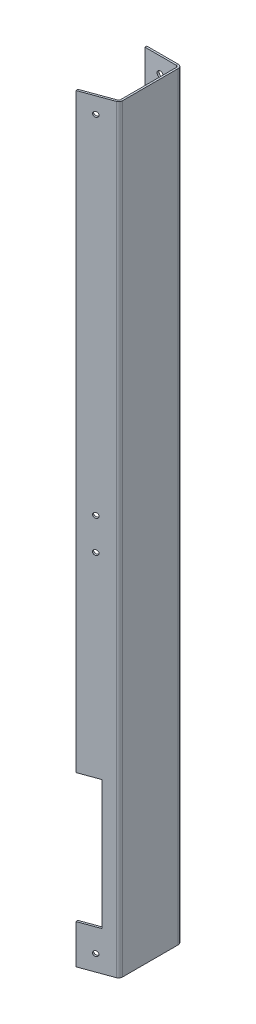
ISO-10303-21;
HEADER;
FILE_DESCRIPTION(('STEP AP214'),'2;1');
FILE_NAME('part.step','',(''),(''),'','','');
FILE_SCHEMA(('AUTOMOTIVE_DESIGN { 1 0 10303 214 1 1 1 1 }'));
ENDSEC;
DATA;
#1=APPLICATION_CONTEXT('core data for automotive mechanical design processes');
#2=APPLICATION_PROTOCOL_DEFINITION('international standard','automotive_design',2000,#1);
#3=PRODUCT_CONTEXT('',#1,'mechanical');
#4=PRODUCT('Part','Part','',(#3));
#5=PRODUCT_RELATED_PRODUCT_CATEGORY('part','',(#4));
#6=PRODUCT_DEFINITION_FORMATION('','',#4);
#7=PRODUCT_DEFINITION_CONTEXT('part definition',#1,'design');
#8=PRODUCT_DEFINITION('design','',#6,#7);
#9=PRODUCT_DEFINITION_SHAPE('','',#8);
#10=(LENGTH_UNIT() NAMED_UNIT(*) SI_UNIT(.MILLI.,.METRE.));
#11=(NAMED_UNIT(*) PLANE_ANGLE_UNIT() SI_UNIT($,.RADIAN.));
#12=(NAMED_UNIT(*) SI_UNIT($,.STERADIAN.) SOLID_ANGLE_UNIT());
#13=UNCERTAINTY_MEASURE_WITH_UNIT(LENGTH_MEASURE(1.E-05),#10,'distance_accuracy_value','');
#14=(GEOMETRIC_REPRESENTATION_CONTEXT(3) GLOBAL_UNCERTAINTY_ASSIGNED_CONTEXT((#13)) GLOBAL_UNIT_ASSIGNED_CONTEXT((#10,
#11,#12)) REPRESENTATION_CONTEXT('',''));
#15=CARTESIAN_POINT('',(0.,0.,0.));
#16=DIRECTION('',(0.,0.,1.));
#17=DIRECTION('',(1.,0.,0.));
#18=AXIS2_PLACEMENT_3D('',#15,#16,#17);
#19=CARTESIAN_POINT('',(-25.7459869181647,-300.,32.3745062313051));
#20=DIRECTION('',(-0.93969262078591,0.,0.342020143325666));
#21=DIRECTION('',(0.342020143325666,0.,0.93969262078591));
#22=AXIS2_PLACEMENT_3D('',#19,#20,#21);
#23=PLANE('',#22);
#24=DIRECTION('',(0.,-1.,0.));
#25=VECTOR('',#24,1.);
#26=CARTESIAN_POINT('',(-25.7459869181647,-300.,32.3745062313051));
#27=LINE('',#26,#25);
#28=CARTESIAN_POINT('',(-25.7459869181647,300.,32.3745062313051));
#29=VERTEX_POINT('',#28);
#30=CARTESIAN_POINT('',(-25.7459869181647,-167.,32.3745062313051));
#31=VERTEX_POINT('',#30);
#32=EDGE_CURVE('E311',#29,#31,#27,.T.);
#33=ORIENTED_EDGE('',*,*,#32,.T.);
#34=DIRECTION('',(0.342020143325666,0.,0.939692620785909));
#35=VECTOR('',#34,1.);
#36=CARTESIAN_POINT('',(-44.3056389205256,-167.,-18.6177185581176));
#37=LINE('',#36,#35);
#38=CARTESIAN_POINT('',(-25.2329567031762,-167.,33.7840451624839));
#39=VERTEX_POINT('',#38);
#40=EDGE_CURVE('E287',#31,#39,#37,.T.);
#41=ORIENTED_EDGE('',*,*,#40,.T.);
#42=DIRECTION('',(0.,-1.,0.));
#43=VECTOR('',#42,1.);
#44=CARTESIAN_POINT('',(-25.2329567031762,-300.,33.7840451624839));
#45=LINE('',#44,#43);
#46=CARTESIAN_POINT('',(-25.2329567031762,300.,33.7840451624839));
#47=VERTEX_POINT('',#46);
#48=EDGE_CURVE('E535',#47,#39,#45,.T.);
#49=ORIENTED_EDGE('',*,*,#48,.F.);
#50=DIRECTION('',(0.342020143325666,0.,0.93969262078591));
#51=VECTOR('',#50,1.);
#52=CARTESIAN_POINT('',(-25.7459869181647,300.,32.3745062313051));
#53=LINE('',#52,#51);
#54=EDGE_CURVE('E319',#29,#47,#53,.T.);
#55=ORIENTED_EDGE('',*,*,#54,.F.);
#56=EDGE_LOOP('',(#33,#41,#49,#55));
#57=FACE_BOUND('',#56,.T.);
#58=ADVANCED_FACE('F175',(#57),#23,.T.);
#59=CARTESIAN_POINT('',(22.1342917352885,0.,-24.6000000000001));
#60=DIRECTION('',(0.,0.,1.));
#61=DIRECTION('',(1.,0.,0.));
#62=AXIS2_PLACEMENT_3D('',#59,#60,#61);
#63=PLANE('',#62);
#64=CARTESIAN_POINT('',(-15.7,-87.2999999999995,-24.6));
#65=DIRECTION('',(0.,0.,-1.));
#66=DIRECTION('',(-1.,0.,0.));
#67=AXIS2_PLACEMENT_3D('',#64,#65,#66);
#68=CIRCLE('',#67,2.5);
#69=CARTESIAN_POINT('',(-18.2,-87.2999999999995,-24.6));
#70=VERTEX_POINT('',#69);
#71=EDGE_CURVE('E587',#70,#70,#68,.T.);
#72=ORIENTED_EDGE('',*,*,#71,.F.);
#73=EDGE_LOOP('',(#72));
#74=FACE_BOUND('',#73,.T.);
#75=CARTESIAN_POINT('',(-15.7,287.3,-24.6));
#76=DIRECTION('',(0.,0.,-1.));
#77=DIRECTION('',(-1.,0.,0.));
#78=AXIS2_PLACEMENT_3D('',#75,#76,#77);
#79=CIRCLE('',#78,2.5);
#80=CARTESIAN_POINT('',(-18.2,287.3,-24.6));
#81=VERTEX_POINT('',#80);
#82=EDGE_CURVE('E573',#81,#81,#79,.T.);
#83=ORIENTED_EDGE('',*,*,#82,.F.);
#84=EDGE_LOOP('',(#83));
#85=FACE_BOUND('',#84,.T.);
#86=DIRECTION('',(0.,1.,0.));
#87=VECTOR('',#86,1.);
#88=CARTESIAN_POINT('',(-3.00000000000001,0.,-24.6));
#89=LINE('',#88,#87);
#90=CARTESIAN_POINT('',(-3.00000000000001,-299.999999999999,-24.6));
#91=VERTEX_POINT('',#90);
#92=CARTESIAN_POINT('',(-3.00000000000001,300.,-24.6));
#93=VERTEX_POINT('',#92);
#94=EDGE_CURVE('E416',#91,#93,#89,.T.);
#95=ORIENTED_EDGE('',*,*,#94,.F.);
#96=DIRECTION('',(-1.,0.,0.));
#97=VECTOR('',#96,1.);
#98=CARTESIAN_POINT('',(-27.8657082647115,-300.,-24.5999999999999));
#99=LINE('',#98,#97);
#100=CARTESIAN_POINT('',(-27.8657082647115,-300.,-24.5999999999999));
#101=VERTEX_POINT('',#100);
#102=EDGE_CURVE('E401',#91,#101,#99,.T.);
#103=ORIENTED_EDGE('',*,*,#102,.T.);
#104=DIRECTION('',(0.,1.,0.));
#105=VECTOR('',#104,1.);
#106=CARTESIAN_POINT('',(-27.8657082647115,-300.,-24.5999999999999));
#107=LINE('',#106,#105);
#108=CARTESIAN_POINT('',(-27.8657082647115,300.,-24.5999999999999));
#109=VERTEX_POINT('',#108);
#110=EDGE_CURVE('E399',#101,#109,#107,.T.);
#111=ORIENTED_EDGE('',*,*,#110,.T.);
#112=DIRECTION('',(1.,0.,0.));
#113=VECTOR('',#112,1.);
#114=CARTESIAN_POINT('',(-27.8657082647115,300.,-24.5999999999999));
#115=LINE('',#114,#113);
#116=EDGE_CURVE('E429',#109,#93,#115,.T.);
#117=ORIENTED_EDGE('',*,*,#116,.T.);
#118=EDGE_LOOP('',(#95,#103,#111,#117));
#119=FACE_BOUND('',#118,.T.);
#120=CARTESIAN_POINT('',(-15.7,87.3,-24.6));
#121=DIRECTION('',(0.,0.,-1.));
#122=DIRECTION('',(-1.,0.,0.));
#123=AXIS2_PLACEMENT_3D('',#120,#121,#122);
#124=CIRCLE('',#123,2.5);
#125=CARTESIAN_POINT('',(-18.2,87.3,-24.6));
#126=VERTEX_POINT('',#125);
#127=EDGE_CURVE('E584',#126,#126,#124,.T.);
#128=ORIENTED_EDGE('',*,*,#127,.F.);
#129=EDGE_LOOP('',(#128));
#130=FACE_BOUND('',#129,.T.);
#131=CARTESIAN_POINT('',(-15.7,-287.299999999999,-24.6));
#132=DIRECTION('',(0.,0.,-1.));
#133=DIRECTION('',(-1.,0.,0.));
#134=AXIS2_PLACEMENT_3D('',#131,#132,#133);
#135=CIRCLE('',#134,2.5);
#136=CARTESIAN_POINT('',(-18.2,-287.299999999999,-24.6));
#137=VERTEX_POINT('',#136);
#138=EDGE_CURVE('E596',#137,#137,#135,.T.);
#139=ORIENTED_EDGE('',*,*,#138,.F.);
#140=EDGE_LOOP('',(#139));
#141=FACE_BOUND('',#140,.T.);
#142=ADVANCED_FACE('F656',(#74,#85,#119,#130,#141),#63,.F.);
#143=CARTESIAN_POINT('',(-1.5,300.,-50.));
#144=DIRECTION('',(0.,1.,0.));
#145=DIRECTION('',(0.,0.,1.));
#146=AXIS2_PLACEMENT_3D('',#143,#144,#145);
#147=PLANE('',#146);
#148=DIRECTION('',(0.,0.,1.));
#149=VECTOR('',#148,1.);
#150=CARTESIAN_POINT('',(-1.5,300.,-50.));
#151=LINE('',#150,#149);
#152=CARTESIAN_POINT('',(-1.5,300.,-21.6));
#153=VERTEX_POINT('',#152);
#154=CARTESIAN_POINT('',(-1.5,300.,22.4993773853709));
#155=VERTEX_POINT('',#154);
#156=EDGE_CURVE('E433',#153,#155,#151,.T.);
#157=ORIENTED_EDGE('',*,*,#156,.T.);
#158=DIRECTION('',(1.,0.,0.));
#159=VECTOR('',#158,1.);
#160=CARTESIAN_POINT('',(-1.5,300.,22.4993773853709));
#161=LINE('',#160,#159);
#162=CARTESIAN_POINT('',(0.,300.,22.4993773853709));
#163=VERTEX_POINT('',#162);
#164=EDGE_CURVE('E12',#155,#163,#161,.T.);
#165=ORIENTED_EDGE('',*,*,#164,.T.);
#166=DIRECTION('',(0.,0.,1.));
#167=VECTOR('',#166,1.);
#168=CARTESIAN_POINT('',(0.,300.,-50.));
#169=LINE('',#168,#167);
#170=CARTESIAN_POINT('',(0.,300.,-21.6));
#171=VERTEX_POINT('',#170);
#172=EDGE_CURVE('E378',#171,#163,#169,.T.);
#173=ORIENTED_EDGE('',*,*,#172,.F.);
#174=DIRECTION('',(1.,0.,0.));
#175=VECTOR('',#174,1.);
#176=CARTESIAN_POINT('',(-1.5,300.,-21.6));
#177=LINE('',#176,#175);
#178=EDGE_CURVE('E383',#153,#171,#177,.T.);
#179=ORIENTED_EDGE('',*,*,#178,.F.);
#180=EDGE_LOOP('',(#157,#165,#173,#179));
#181=FACE_BOUND('',#180,.T.);
#182=ADVANCED_FACE('F172',(#181),#147,.T.);
#183=CARTESIAN_POINT('',(-1.5,-300.,-50.));
#184=DIRECTION('',(0.,-1.,0.));
#185=DIRECTION('',(0.,0.,-1.));
#186=AXIS2_PLACEMENT_3D('',#183,#184,#185);
#187=PLANE('',#186);
#188=DIRECTION('',(0.,0.,-1.));
#189=VECTOR('',#188,1.);
#190=CARTESIAN_POINT('',(0.,-300.,-50.));
#191=LINE('',#190,#189);
#192=CARTESIAN_POINT('',(0.,-300.,22.4993773853709));
#193=VERTEX_POINT('',#192);
#194=CARTESIAN_POINT('',(0.,-300.,-21.6));
#195=VERTEX_POINT('',#194);
#196=EDGE_CURVE('E379',#193,#195,#191,.T.);
#197=ORIENTED_EDGE('',*,*,#196,.F.);
#198=DIRECTION('',(-1.,0.,0.));
#199=VECTOR('',#198,1.);
#200=CARTESIAN_POINT('',(-1.5,-300.,22.4993773853709));
#201=LINE('',#200,#199);
#202=CARTESIAN_POINT('',(-1.5,-300.,22.4993773853709));
#203=VERTEX_POINT('',#202);
#204=EDGE_CURVE('E441',#193,#203,#201,.T.);
#205=ORIENTED_EDGE('',*,*,#204,.T.);
#206=DIRECTION('',(0.,0.,-1.));
#207=VECTOR('',#206,1.);
#208=CARTESIAN_POINT('',(-1.5,-300.,-50.));
#209=LINE('',#208,#207);
#210=CARTESIAN_POINT('',(-1.5,-300.,-21.6));
#211=VERTEX_POINT('',#210);
#212=EDGE_CURVE('E176',#203,#211,#209,.T.);
#213=ORIENTED_EDGE('',*,*,#212,.T.);
#214=DIRECTION('',(-1.,0.,0.));
#215=VECTOR('',#214,1.);
#216=CARTESIAN_POINT('',(-1.5,-300.,-21.6));
#217=LINE('',#216,#215);
#218=EDGE_CURVE('E382',#195,#211,#217,.T.);
#219=ORIENTED_EDGE('',*,*,#218,.F.);
#220=EDGE_LOOP('',(#197,#205,#213,#219));
#221=FACE_BOUND('',#220,.T.);
#222=ADVANCED_FACE('F462',(#221),#187,.T.);
#223=CARTESIAN_POINT('',(-1.5,0.,0.));
#224=DIRECTION('',(-1.,0.,0.));
#225=DIRECTION('',(0.,0.,1.));
#226=AXIS2_PLACEMENT_3D('',#223,#224,#225);
#227=PLANE('',#226);
#228=ORIENTED_EDGE('',*,*,#212,.F.);
#229=DIRECTION('',(0.,1.,0.));
#230=VECTOR('',#229,1.);
#231=CARTESIAN_POINT('',(-1.5,0.,22.4993773853709));
#232=LINE('',#231,#230);
#233=EDGE_CURVE('E424',#203,#155,#232,.T.);
#234=ORIENTED_EDGE('',*,*,#233,.T.);
#235=ORIENTED_EDGE('',*,*,#156,.F.);
#236=DIRECTION('',(0.,1.,0.));
#237=VECTOR('',#236,1.);
#238=CARTESIAN_POINT('',(-1.5,0.,-21.6));
#239=LINE('',#238,#237);
#240=EDGE_CURVE('E368',#211,#153,#239,.T.);
#241=ORIENTED_EDGE('',*,*,#240,.F.);
#242=EDGE_LOOP('',(#228,#234,#235,#241));
#243=FACE_BOUND('',#242,.T.);
#244=ADVANCED_FACE('F465',(#243),#227,.T.);
#245=CARTESIAN_POINT('',(-27.8657082647115,300.,-23.0999999999999));
#246=DIRECTION('',(0.,1.,0.));
#247=DIRECTION('',(1.,0.,0.));
#248=AXIS2_PLACEMENT_3D('',#245,#246,#247);
#249=PLANE('',#248);
#250=DIRECTION('',(1.,0.,0.));
#251=VECTOR('',#250,1.);
#252=CARTESIAN_POINT('',(-27.8657082647115,300.,-23.0999999999999));
#253=LINE('',#252,#251);
#254=CARTESIAN_POINT('',(-27.8657082647115,300.,-23.0999999999999));
#255=VERTEX_POINT('',#254);
#256=CARTESIAN_POINT('',(-3.00000000000001,300.,-23.1));
#257=VERTEX_POINT('',#256);
#258=EDGE_CURVE('E405',#255,#257,#253,.T.);
#259=ORIENTED_EDGE('',*,*,#258,.T.);
#260=DIRECTION('',(0.,0.,-1.));
#261=VECTOR('',#260,1.);
#262=CARTESIAN_POINT('',(-3.00000000000001,300.,-23.1));
#263=LINE('',#262,#261);
#264=EDGE_CURVE('E423',#257,#93,#263,.T.);
#265=ORIENTED_EDGE('',*,*,#264,.T.);
#266=ORIENTED_EDGE('',*,*,#116,.F.);
#267=DIRECTION('',(0.,0.,-1.));
#268=VECTOR('',#267,1.);
#269=CARTESIAN_POINT('',(-27.8657082647115,300.,-23.0999999999999));
#270=LINE('',#269,#268);
#271=EDGE_CURVE('E404',#255,#109,#270,.T.);
#272=ORIENTED_EDGE('',*,*,#271,.F.);
#273=EDGE_LOOP('',(#259,#265,#266,#272));
#274=FACE_BOUND('',#273,.T.);
#275=ADVANCED_FACE('F483',(#274),#249,.T.);
#276=CARTESIAN_POINT('',(-27.8657082647115,-300.,-23.0999999999999));
#277=DIRECTION('',(0.,-1.,0.));
#278=DIRECTION('',(-1.,0.,0.));
#279=AXIS2_PLACEMENT_3D('',#276,#277,#278);
#280=PLANE('',#279);
#281=ORIENTED_EDGE('',*,*,#102,.F.);
#282=DIRECTION('',(0.,0.,1.));
#283=VECTOR('',#282,1.);
#284=CARTESIAN_POINT('',(-3.00000000000001,-300.,-23.1));
#285=LINE('',#284,#283);
#286=CARTESIAN_POINT('',(-3.00000000000001,-300.,-23.1));
#287=VERTEX_POINT('',#286);
#288=EDGE_CURVE('E412',#91,#287,#285,.T.);
#289=ORIENTED_EDGE('',*,*,#288,.T.);
#290=DIRECTION('',(-1.,0.,0.));
#291=VECTOR('',#290,1.);
#292=CARTESIAN_POINT('',(-27.8657082647115,-300.,-23.0999999999999));
#293=LINE('',#292,#291);
#294=CARTESIAN_POINT('',(-27.8657082647115,-300.,-23.0999999999999));
#295=VERTEX_POINT('',#294);
#296=EDGE_CURVE('E397',#287,#295,#293,.T.);
#297=ORIENTED_EDGE('',*,*,#296,.T.);
#298=DIRECTION('',(0.,0.,-1.));
#299=VECTOR('',#298,1.);
#300=CARTESIAN_POINT('',(-27.8657082647115,-300.,-23.0999999999999));
#301=LINE('',#300,#299);
#302=EDGE_CURVE('E396',#295,#101,#301,.T.);
#303=ORIENTED_EDGE('',*,*,#302,.T.);
#304=EDGE_LOOP('',(#281,#289,#297,#303));
#305=FACE_BOUND('',#304,.T.);
#306=ADVANCED_FACE('F490',(#305),#280,.T.);
#307=CARTESIAN_POINT('',(22.1342917352885,0.,-23.1000000000001));
#308=DIRECTION('',(0.,0.,1.));
#309=DIRECTION('',(1.,0.,0.));
#310=AXIS2_PLACEMENT_3D('',#307,#308,#309);
#311=PLANE('',#310);
#312=CARTESIAN_POINT('',(-15.7,-287.299999999999,-23.1));
#313=DIRECTION('',(0.,0.,1.));
#314=DIRECTION('',(1.,0.,0.));
#315=AXIS2_PLACEMENT_3D('',#312,#313,#314);
#316=CIRCLE('',#315,2.5);
#317=CARTESIAN_POINT('',(-13.2,-287.299999999999,-23.1));
#318=VERTEX_POINT('',#317);
#319=EDGE_CURVE('E593',#318,#318,#316,.T.);
#320=ORIENTED_EDGE('',*,*,#319,.F.);
#321=EDGE_LOOP('',(#320));
#322=FACE_BOUND('',#321,.T.);
#323=CARTESIAN_POINT('',(-15.7,-87.2999999999995,-23.1));
#324=DIRECTION('',(0.,0.,1.));
#325=DIRECTION('',(1.,0.,0.));
#326=AXIS2_PLACEMENT_3D('',#323,#324,#325);
#327=CIRCLE('',#326,2.5);
#328=CARTESIAN_POINT('',(-13.2,-87.2999999999995,-23.1));
#329=VERTEX_POINT('',#328);
#330=EDGE_CURVE('E589',#329,#329,#327,.T.);
#331=ORIENTED_EDGE('',*,*,#330,.F.);
#332=EDGE_LOOP('',(#331));
#333=FACE_BOUND('',#332,.T.);
#334=CARTESIAN_POINT('',(-15.7,87.3,-23.1));
#335=DIRECTION('',(0.,0.,1.));
#336=DIRECTION('',(1.,0.,0.));
#337=AXIS2_PLACEMENT_3D('',#334,#335,#336);
#338=CIRCLE('',#337,2.5);
#339=CARTESIAN_POINT('',(-13.2,87.3,-23.1));
#340=VERTEX_POINT('',#339);
#341=EDGE_CURVE('E579',#340,#340,#338,.T.);
#342=ORIENTED_EDGE('',*,*,#341,.F.);
#343=EDGE_LOOP('',(#342));
#344=FACE_BOUND('',#343,.T.);
#345=CARTESIAN_POINT('',(-15.7,287.3,-23.1));
#346=DIRECTION('',(0.,0.,1.));
#347=DIRECTION('',(1.,0.,0.));
#348=AXIS2_PLACEMENT_3D('',#345,#346,#347);
#349=CIRCLE('',#348,2.5);
#350=CARTESIAN_POINT('',(-13.2,287.3,-23.1));
#351=VERTEX_POINT('',#350);
#352=EDGE_CURVE('E569',#351,#351,#349,.T.);
#353=ORIENTED_EDGE('',*,*,#352,.F.);
#354=EDGE_LOOP('',(#353));
#355=FACE_BOUND('',#354,.T.);
#356=ORIENTED_EDGE('',*,*,#296,.F.);
#357=DIRECTION('',(0.,1.,0.));
#358=VECTOR('',#357,1.);
#359=CARTESIAN_POINT('',(-3.00000000000001,0.,-23.1));
#360=LINE('',#359,#358);
#361=EDGE_CURVE('E409',#287,#257,#360,.T.);
#362=ORIENTED_EDGE('',*,*,#361,.T.);
#363=ORIENTED_EDGE('',*,*,#258,.F.);
#364=DIRECTION('',(0.,1.,0.));
#365=VECTOR('',#364,1.);
#366=CARTESIAN_POINT('',(-27.8657082647115,-300.,-23.0999999999999));
#367=LINE('',#366,#365);
#368=EDGE_CURVE('E391',#295,#255,#367,.T.);
#369=ORIENTED_EDGE('',*,*,#368,.F.);
#370=EDGE_LOOP('',(#356,#362,#363,#369));
#371=FACE_BOUND('',#370,.T.);
#372=ADVANCED_FACE('F478',(#322,#333,#344,#355,#371),#311,.T.);
#373=CARTESIAN_POINT('',(-27.8657082647115,-300.,-23.0999999999999));
#374=DIRECTION('',(-1.,0.,0.));
#375=DIRECTION('',(0.,0.,1.));
#376=AXIS2_PLACEMENT_3D('',#373,#374,#375);
#377=PLANE('',#376);
#378=ORIENTED_EDGE('',*,*,#110,.F.);
#379=ORIENTED_EDGE('',*,*,#302,.F.);
#380=ORIENTED_EDGE('',*,*,#368,.T.);
#381=ORIENTED_EDGE('',*,*,#271,.T.);
#382=EDGE_LOOP('',(#378,#379,#380,#381));
#383=FACE_BOUND('',#382,.T.);
#384=ADVANCED_FACE('F484',(#383),#377,.T.);
#385=CARTESIAN_POINT('',(0.,0.,0.));
#386=DIRECTION('',(-1.,0.,0.));
#387=DIRECTION('',(0.,0.,1.));
#388=AXIS2_PLACEMENT_3D('',#385,#386,#387);
#389=PLANE('',#388);
#390=DIRECTION('',(0.,1.,0.));
#391=VECTOR('',#390,1.);
#392=CARTESIAN_POINT('',(0.,0.,22.4993773853709));
#393=LINE('',#392,#391);
#394=EDGE_CURVE('E185',#193,#163,#393,.T.);
#395=ORIENTED_EDGE('',*,*,#394,.F.);
#396=ORIENTED_EDGE('',*,*,#196,.T.);
#397=DIRECTION('',(0.,1.,0.));
#398=VECTOR('',#397,1.);
#399=CARTESIAN_POINT('',(0.,0.,-21.6));
#400=LINE('',#399,#398);
#401=EDGE_CURVE('E374',#195,#171,#400,.T.);
#402=ORIENTED_EDGE('',*,*,#401,.T.);
#403=ORIENTED_EDGE('',*,*,#172,.T.);
#404=EDGE_LOOP('',(#395,#396,#402,#403));
#405=FACE_BOUND('',#404,.T.);
#406=ADVANCED_FACE('F494',(#405),#389,.F.);
#407=CARTESIAN_POINT('',(-3.,-300.,-21.6));
#408=DIRECTION('',(0.,1.,0.));
#409=DIRECTION('',(0.,0.,1.));
#410=AXIS2_PLACEMENT_3D('',#407,#408,#409);
#411=PLANE('',#410);
#412=ORIENTED_EDGE('',*,*,#288,.F.);
#413=CARTESIAN_POINT('',(-3.,-299.999999999999,-21.6));
#414=DIRECTION('',(0.,-1.,0.));
#415=DIRECTION('',(0.,0.,-1.));
#416=AXIS2_PLACEMENT_3D('',#413,#414,#415);
#417=CIRCLE('',#416,3.);
#418=EDGE_CURVE('E351',#91,#195,#417,.T.);
#419=ORIENTED_EDGE('',*,*,#418,.T.);
#420=ORIENTED_EDGE('',*,*,#218,.T.);
#421=CARTESIAN_POINT('',(-3.,-300.,-21.6));
#422=DIRECTION('',(0.,-1.,0.));
#423=DIRECTION('',(0.,0.,1.));
#424=AXIS2_PLACEMENT_3D('',#421,#422,#423);
#425=CIRCLE('',#424,1.5);
#426=EDGE_CURVE('E359',#287,#211,#425,.T.);
#427=ORIENTED_EDGE('',*,*,#426,.F.);
#428=EDGE_LOOP('',(#412,#419,#420,#427));
#429=FACE_BOUND('',#428,.T.);
#430=ADVANCED_FACE('F473',(#429),#411,.F.);
#431=CARTESIAN_POINT('',(-3.,300.,-21.6));
#432=DIRECTION('',(0.,-1.,0.));
#433=DIRECTION('',(0.,0.,-1.));
#434=AXIS2_PLACEMENT_3D('',#431,#432,#433);
#435=PLANE('',#434);
#436=CARTESIAN_POINT('',(-3.,300.,-21.6));
#437=DIRECTION('',(0.,-1.,0.));
#438=DIRECTION('',(0.,0.,-1.));
#439=AXIS2_PLACEMENT_3D('',#436,#437,#438);
#440=CIRCLE('',#439,3.);
#441=EDGE_CURVE('E362',#171,#93,#440,.F.);
#442=ORIENTED_EDGE('',*,*,#441,.T.);
#443=ORIENTED_EDGE('',*,*,#264,.F.);
#444=CARTESIAN_POINT('',(-3.,300.,-21.6));
#445=DIRECTION('',(0.,1.,0.));
#446=DIRECTION('',(0.,0.,-1.));
#447=AXIS2_PLACEMENT_3D('',#444,#445,#446);
#448=CIRCLE('',#447,1.5);
#449=EDGE_CURVE('E364',#153,#257,#448,.T.);
#450=ORIENTED_EDGE('',*,*,#449,.F.);
#451=ORIENTED_EDGE('',*,*,#178,.T.);
#452=EDGE_LOOP('',(#442,#443,#450,#451));
#453=FACE_BOUND('',#452,.T.);
#454=ADVANCED_FACE('F496',(#453),#435,.F.);
#455=CARTESIAN_POINT('',(-3.,600.01228422264,-21.6));
#456=DIRECTION('',(0.,-1.,0.));
#457=DIRECTION('',(0.,0.,-1.));
#458=AXIS2_PLACEMENT_3D('',#455,#456,#457);
#459=CYLINDRICAL_SURFACE('',#458,1.5);
#460=ORIENTED_EDGE('',*,*,#240,.T.);
#461=ORIENTED_EDGE('',*,*,#449,.T.);
#462=ORIENTED_EDGE('',*,*,#361,.F.);
#463=ORIENTED_EDGE('',*,*,#426,.T.);
#464=EDGE_LOOP('',(#460,#461,#462,#463));
#465=FACE_BOUND('',#464,.T.);
#466=ADVANCED_FACE('F475',(#465),#459,.F.);
#467=CARTESIAN_POINT('',(-3.,600.01228422264,-21.6));
#468=DIRECTION('',(0.,-1.,0.));
#469=DIRECTION('',(0.,0.,-1.));
#470=AXIS2_PLACEMENT_3D('',#467,#468,#469);
#471=CYLINDRICAL_SURFACE('',#470,3.);
#472=ORIENTED_EDGE('',*,*,#401,.F.);
#473=ORIENTED_EDGE('',*,*,#418,.F.);
#474=ORIENTED_EDGE('',*,*,#94,.T.);
#475=ORIENTED_EDGE('',*,*,#441,.F.);
#476=EDGE_LOOP('',(#472,#473,#474,#475));
#477=FACE_BOUND('',#476,.T.);
#478=ADVANCED_FACE('F495',(#477),#471,.T.);
#479=CARTESIAN_POINT('',(-3.,-300.,22.4993773853709));
#480=DIRECTION('',(0.,1.,0.));
#481=DIRECTION('',(0.,0.,1.));
#482=AXIS2_PLACEMENT_3D('',#479,#480,#481);
#483=PLANE('',#482);
#484=ORIENTED_EDGE('',*,*,#204,.F.);
#485=CARTESIAN_POINT('',(-3.,-300.,22.4993773853709));
#486=DIRECTION('',(0.,1.,0.));
#487=DIRECTION('',(0.,0.,1.));
#488=AXIS2_PLACEMENT_3D('',#485,#486,#487);
#489=CIRCLE('',#488,3.);
#490=CARTESIAN_POINT('',(-1.97393957002301,-300.,25.3184552477286));
#491=VERTEX_POINT('',#490);
#492=EDGE_CURVE('E358',#193,#491,#489,.F.);
#493=ORIENTED_EDGE('',*,*,#492,.T.);
#494=DIRECTION('',(-0.342020143325666,0.,-0.93969262078591));
#495=VECTOR('',#494,1.);
#496=CARTESIAN_POINT('',(-2.48696978501151,-300.,23.9089163165497));
#497=LINE('',#496,#495);
#498=CARTESIAN_POINT('',(-2.48696978501151,-300.,23.9089163165498));
#499=VERTEX_POINT('',#498);
#500=EDGE_CURVE('E328',#491,#499,#497,.T.);
#501=ORIENTED_EDGE('',*,*,#500,.T.);
#502=CARTESIAN_POINT('',(-3.,-300.,22.4993773853709));
#503=DIRECTION('',(0.,-1.,0.));
#504=DIRECTION('',(0.,0.,1.));
#505=AXIS2_PLACEMENT_3D('',#502,#503,#504);
#506=CIRCLE('',#505,1.5);
#507=EDGE_CURVE('E345',#203,#499,#506,.T.);
#508=ORIENTED_EDGE('',*,*,#507,.F.);
#509=EDGE_LOOP('',(#484,#493,#501,#508));
#510=FACE_BOUND('',#509,.T.);
#511=ADVANCED_FACE('F519',(#510),#483,.F.);
#512=CARTESIAN_POINT('',(-3.,300.,22.4993773853709));
#513=DIRECTION('',(0.,-1.,0.));
#514=DIRECTION('',(0.,0.,-1.));
#515=AXIS2_PLACEMENT_3D('',#512,#513,#514);
#516=PLANE('',#515);
#517=DIRECTION('',(0.342020143325666,0.,0.93969262078591));
#518=VECTOR('',#517,1.);
#519=CARTESIAN_POINT('',(-2.4869697850115,300.,23.9089163165497));
#520=LINE('',#519,#518);
#521=CARTESIAN_POINT('',(-2.4869697850115,300.,23.9089163165497));
#522=VERTEX_POINT('',#521);
#523=CARTESIAN_POINT('',(-1.973939570023,300.,25.3184552477286));
#524=VERTEX_POINT('',#523);
#525=EDGE_CURVE('E335',#522,#524,#520,.T.);
#526=ORIENTED_EDGE('',*,*,#525,.T.);
#527=CARTESIAN_POINT('',(-3.,300.,22.4993773853709));
#528=DIRECTION('',(0.,1.,0.));
#529=DIRECTION('',(0.,0.,1.));
#530=AXIS2_PLACEMENT_3D('',#527,#528,#529);
#531=CIRCLE('',#530,3.);
#532=EDGE_CURVE('E347',#524,#163,#531,.T.);
#533=ORIENTED_EDGE('',*,*,#532,.T.);
#534=ORIENTED_EDGE('',*,*,#164,.F.);
#535=CARTESIAN_POINT('',(-3.,300.,22.4993773853709));
#536=DIRECTION('',(0.,1.,0.));
#537=DIRECTION('',(0.,0.,-1.));
#538=AXIS2_PLACEMENT_3D('',#535,#536,#537);
#539=CIRCLE('',#538,1.5);
#540=EDGE_CURVE('E348',#522,#155,#539,.T.);
#541=ORIENTED_EDGE('',*,*,#540,.F.);
#542=EDGE_LOOP('',(#526,#533,#534,#541));
#543=FACE_BOUND('',#542,.T.);
#544=ADVANCED_FACE('F499',(#543),#516,.F.);
#545=CARTESIAN_POINT('',(-3.,-600.008171957574,22.4993773853709));
#546=DIRECTION('',(0.,1.,0.));
#547=DIRECTION('',(0.,0.,1.));
#548=AXIS2_PLACEMENT_3D('',#545,#546,#547);
#549=CYLINDRICAL_SURFACE('',#548,1.5);
#550=ORIENTED_EDGE('',*,*,#540,.T.);
#551=ORIENTED_EDGE('',*,*,#233,.F.);
#552=ORIENTED_EDGE('',*,*,#507,.T.);
#553=DIRECTION('',(0.,1.,0.));
#554=VECTOR('',#553,1.);
#555=CARTESIAN_POINT('',(-2.4869697850115,0.,23.9089163165497));
#556=LINE('',#555,#554);
#557=EDGE_CURVE('E339',#499,#522,#556,.T.);
#558=ORIENTED_EDGE('',*,*,#557,.T.);
#559=EDGE_LOOP('',(#550,#551,#552,#558));
#560=FACE_BOUND('',#559,.T.);
#561=ADVANCED_FACE('F503',(#560),#549,.F.);
#562=CARTESIAN_POINT('',(-3.,-600.008171957574,22.4993773853709));
#563=DIRECTION('',(0.,1.,0.));
#564=DIRECTION('',(0.,0.,1.));
#565=AXIS2_PLACEMENT_3D('',#562,#563,#564);
#566=CYLINDRICAL_SURFACE('',#565,3.);
#567=ORIENTED_EDGE('',*,*,#532,.F.);
#568=DIRECTION('',(0.,1.,0.));
#569=VECTOR('',#568,1.);
#570=CARTESIAN_POINT('',(-1.973939570023,0.,25.3184552477286));
#571=LINE('',#570,#569);
#572=EDGE_CURVE('E516',#491,#524,#571,.T.);
#573=ORIENTED_EDGE('',*,*,#572,.F.);
#574=ORIENTED_EDGE('',*,*,#492,.F.);
#575=ORIENTED_EDGE('',*,*,#394,.T.);
#576=EDGE_LOOP('',(#567,#573,#574,#575));
#577=FACE_BOUND('',#576,.T.);
#578=ADVANCED_FACE('F517',(#577),#566,.T.);
#579=DIRECTION('',(0.342020143325666,0.,0.939692620785909));
#580=VECTOR('',#579,1.);
#581=CARTESIAN_POINT('',(-44.3056389205256,-269.,-18.6177185581176));
#582=LINE('',#581,#580);
#583=CARTESIAN_POINT('',(-25.7459869181647,-269.,32.3745062313051));
#584=VERTEX_POINT('',#583);
#585=CARTESIAN_POINT('',(-25.2329567031762,-269.,33.7840451624839));
#586=VERTEX_POINT('',#585);
#587=EDGE_CURVE('E301',#584,#586,#582,.T.);
#588=ORIENTED_EDGE('',*,*,#587,.F.);
#589=CARTESIAN_POINT('',(-25.7459869181647,-300.,32.3745062313051));
#590=VERTEX_POINT('',#589);
#591=EDGE_CURVE('E323',#584,#590,#27,.T.);
#592=ORIENTED_EDGE('',*,*,#591,.T.);
#593=DIRECTION('',(0.342020143325666,0.,0.93969262078591));
#594=VECTOR('',#593,1.);
#595=CARTESIAN_POINT('',(-25.7459869181647,-300.,32.3745062313051));
#596=LINE('',#595,#594);
#597=CARTESIAN_POINT('',(-25.2329567031762,-300.,33.7840451624839));
#598=VERTEX_POINT('',#597);
#599=EDGE_CURVE('E318',#590,#598,#596,.T.);
#600=ORIENTED_EDGE('',*,*,#599,.T.);
#601=EDGE_CURVE('E529',#586,#598,#45,.T.);
#602=ORIENTED_EDGE('',*,*,#601,.F.);
#603=EDGE_LOOP('',(#588,#592,#600,#602));
#604=FACE_BOUND('',#603,.T.);
#605=ADVANCED_FACE('F622',(#604),#23,.T.);
#606=CARTESIAN_POINT('',(21.2386441211308,0.,15.2734990650218));
#607=DIRECTION('',(-0.342020143325666,0.,-0.93969262078591));
#608=DIRECTION('',(-0.93969262078591,0.,0.342020143325666));
#609=AXIS2_PLACEMENT_3D('',#606,#607,#608);
#610=PLANE('',#609);
#611=DIRECTION('',(0.939692620785909,0.,-0.342020143325666));
#612=VECTOR('',#611,1.);
#613=CARTESIAN_POINT('',(-25.7459869181647,-269.,32.3745062313051));
#614=LINE('',#613,#612);
#615=CARTESIAN_POINT('',(-10.7109049855902,-269.,26.9021839380944));
#616=VERTEX_POINT('',#615);
#617=EDGE_CURVE('E313',#584,#616,#614,.T.);
#618=ORIENTED_EDGE('',*,*,#617,.T.);
#619=DIRECTION('',(0.,1.,0.));
#620=VECTOR('',#619,1.);
#621=CARTESIAN_POINT('',(-10.7109049855902,-269.,26.9021839380944));
#622=LINE('',#621,#620);
#623=CARTESIAN_POINT('',(-10.7109049855902,-167.,26.9021839380944));
#624=VERTEX_POINT('',#623);
#625=EDGE_CURVE('E315',#616,#624,#622,.T.);
#626=ORIENTED_EDGE('',*,*,#625,.T.);
#627=DIRECTION('',(0.939692620785909,0.,-0.342020143325666));
#628=VECTOR('',#627,1.);
#629=CARTESIAN_POINT('',(-25.7459869181648,-167.,32.3745062313051));
#630=LINE('',#629,#628);
#631=EDGE_CURVE('E292',#31,#624,#630,.T.);
#632=ORIENTED_EDGE('',*,*,#631,.F.);
#633=ORIENTED_EDGE('',*,*,#32,.F.);
#634=DIRECTION('',(-0.93969262078591,0.,0.342020143325666));
#635=VECTOR('',#634,1.);
#636=CARTESIAN_POINT('',(68.2232751604262,300.,-1.82750810126155));
#637=LINE('',#636,#635);
#638=EDGE_CURVE('E510',#522,#29,#637,.T.);
#639=ORIENTED_EDGE('',*,*,#638,.F.);
#640=ORIENTED_EDGE('',*,*,#557,.F.);
#641=DIRECTION('',(0.93969262078591,0.,-0.342020143325666));
#642=VECTOR('',#641,1.);
#643=CARTESIAN_POINT('',(68.2232751604262,-300.,-1.82750810126155));
#644=LINE('',#643,#642);
#645=EDGE_CURVE('E326',#590,#499,#644,.T.);
#646=ORIENTED_EDGE('',*,*,#645,.F.);
#647=ORIENTED_EDGE('',*,*,#591,.F.);
#648=EDGE_LOOP('',(#618,#626,#632,#633,#639,#640,#646,#647));
#649=FACE_BOUND('',#648,.T.);
#650=CARTESIAN_POINT('',(-14.4210660689926,-287.3,28.2525721367857));
#651=DIRECTION('',(-0.342020143325666,0.,-0.93969262078591));
#652=DIRECTION('',(-0.939692620785909,0.,0.342020143325666));
#653=AXIS2_PLACEMENT_3D('',#650,#651,#652);
#654=CIRCLE('',#653,2.);
#655=CARTESIAN_POINT('',(-16.3004513105644,-287.3,28.936612423437));
#656=VERTEX_POINT('',#655);
#657=EDGE_CURVE('E565',#656,#656,#654,.T.);
#658=ORIENTED_EDGE('',*,*,#657,.F.);
#659=EDGE_LOOP('',(#658));
#660=FACE_BOUND('',#659,.T.);
#661=CARTESIAN_POINT('',(-14.4210660689926,-12.7,28.2525721367857));
#662=DIRECTION('',(-0.342020143325666,0.,-0.93969262078591));
#663=DIRECTION('',(-0.939692620785909,0.,0.342020143325666));
#664=AXIS2_PLACEMENT_3D('',#661,#662,#663);
#665=CIRCLE('',#664,2.);
#666=CARTESIAN_POINT('',(-16.3004513105644,-12.7,28.936612423437));
#667=VERTEX_POINT('',#666);
#668=EDGE_CURVE('E555',#667,#667,#665,.T.);
#669=ORIENTED_EDGE('',*,*,#668,.F.);
#670=EDGE_LOOP('',(#669));
#671=FACE_BOUND('',#670,.T.);
#672=CARTESIAN_POINT('',(-14.4210660689926,287.3,28.2525721367857));
#673=DIRECTION('',(-0.342020143325666,0.,-0.93969262078591));
#674=DIRECTION('',(-0.939692620785909,0.,0.342020143325666));
#675=AXIS2_PLACEMENT_3D('',#672,#673,#674);
#676=CIRCLE('',#675,2.);
#677=CARTESIAN_POINT('',(-16.3004513105644,287.3,28.936612423437));
#678=VERTEX_POINT('',#677);
#679=EDGE_CURVE('E548',#678,#678,#676,.T.);
#680=ORIENTED_EDGE('',*,*,#679,.F.);
#681=EDGE_LOOP('',(#680));
#682=FACE_BOUND('',#681,.T.);
#683=CARTESIAN_POINT('',(-14.4210660689926,12.7,28.2525721367857));
#684=DIRECTION('',(-0.342020143325666,0.,-0.93969262078591));
#685=DIRECTION('',(-0.939692620785909,0.,0.342020143325666));
#686=AXIS2_PLACEMENT_3D('',#683,#684,#685);
#687=CIRCLE('',#686,2.);
#688=CARTESIAN_POINT('',(-16.3004513105644,12.7,28.936612423437));
#689=VERTEX_POINT('',#688);
#690=EDGE_CURVE('E342',#689,#689,#687,.T.);
#691=ORIENTED_EDGE('',*,*,#690,.F.);
#692=EDGE_LOOP('',(#691));
#693=FACE_BOUND('',#692,.T.);
#694=ADVANCED_FACE('F308',(#649,#660,#671,#682,#693),#610,.T.);
#695=CARTESIAN_POINT('',(68.2232751604262,-300.,-1.82750810126155));
#696=DIRECTION('',(0.,-1.,0.));
#697=DIRECTION('',(0.93969262078591,0.,-0.342020143325666));
#698=AXIS2_PLACEMENT_3D('',#695,#696,#697);
#699=PLANE('',#698);
#700=ORIENTED_EDGE('',*,*,#500,.F.);
#701=DIRECTION('',(0.93969262078591,0.,-0.342020143325666));
#702=VECTOR('',#701,1.);
#703=CARTESIAN_POINT('',(68.7363053754147,-300.,-0.417969170082681));
#704=LINE('',#703,#702);
#705=EDGE_CURVE('E513',#598,#491,#704,.T.);
#706=ORIENTED_EDGE('',*,*,#705,.F.);
#707=ORIENTED_EDGE('',*,*,#599,.F.);
#708=ORIENTED_EDGE('',*,*,#645,.T.);
#709=EDGE_LOOP('',(#700,#706,#707,#708));
#710=FACE_BOUND('',#709,.T.);
#711=ADVANCED_FACE('F512',(#710),#699,.T.);
#712=CARTESIAN_POINT('',(21.7516743361193,0.,16.6830379962006));
#713=DIRECTION('',(-0.342020143325666,0.,-0.93969262078591));
#714=DIRECTION('',(-0.93969262078591,0.,0.342020143325666));
#715=AXIS2_PLACEMENT_3D('',#712,#713,#714);
#716=PLANE('',#715);
#717=DIRECTION('',(0.,1.,0.));
#718=VECTOR('',#717,1.);
#719=CARTESIAN_POINT('',(-10.1978747706017,-269.,28.3117228692733));
#720=LINE('',#719,#718);
#721=CARTESIAN_POINT('',(-10.1978747706017,-269.,28.3117228692733));
#722=VERTEX_POINT('',#721);
#723=CARTESIAN_POINT('',(-10.1978747706017,-167.,28.3117228692733));
#724=VERTEX_POINT('',#723);
#725=EDGE_CURVE('E611',#722,#724,#720,.T.);
#726=ORIENTED_EDGE('',*,*,#725,.F.);
#727=DIRECTION('',(0.939692620785909,0.,-0.342020143325666));
#728=VECTOR('',#727,1.);
#729=CARTESIAN_POINT('',(-25.2329567031762,-269.,33.7840451624839));
#730=LINE('',#729,#728);
#731=EDGE_CURVE('E188',#586,#722,#730,.T.);
#732=ORIENTED_EDGE('',*,*,#731,.F.);
#733=ORIENTED_EDGE('',*,*,#601,.T.);
#734=ORIENTED_EDGE('',*,*,#705,.T.);
#735=ORIENTED_EDGE('',*,*,#572,.T.);
#736=DIRECTION('',(-0.93969262078591,0.,0.342020143325666));
#737=VECTOR('',#736,1.);
#738=CARTESIAN_POINT('',(68.7363053754147,300.,-0.417969170082688));
#739=LINE('',#738,#737);
#740=EDGE_CURVE('E525',#524,#47,#739,.T.);
#741=ORIENTED_EDGE('',*,*,#740,.T.);
#742=ORIENTED_EDGE('',*,*,#48,.T.);
#743=DIRECTION('',(0.939692620785909,0.,-0.342020143325666));
#744=VECTOR('',#743,1.);
#745=CARTESIAN_POINT('',(-25.2329567031762,-167.,33.7840451624839));
#746=LINE('',#745,#744);
#747=EDGE_CURVE('E294',#39,#724,#746,.T.);
#748=ORIENTED_EDGE('',*,*,#747,.T.);
#749=EDGE_LOOP('',(#726,#732,#733,#734,#735,#741,#742,#748));
#750=FACE_BOUND('',#749,.T.);
#751=CARTESIAN_POINT('',(-13.9080358540041,-287.3,29.6621110679646));
#752=DIRECTION('',(0.342020143325666,0.,0.939692620785909));
#753=DIRECTION('',(0.939692620785909,0.,-0.342020143325666));
#754=AXIS2_PLACEMENT_3D('',#751,#752,#753);
#755=CIRCLE('',#754,2.);
#756=CARTESIAN_POINT('',(-12.0286506124322,-287.3,28.9780707813132));
#757=VERTEX_POINT('',#756);
#758=EDGE_CURVE('E566',#757,#757,#755,.T.);
#759=ORIENTED_EDGE('',*,*,#758,.F.);
#760=EDGE_LOOP('',(#759));
#761=FACE_BOUND('',#760,.T.);
#762=CARTESIAN_POINT('',(-13.9080358540041,-12.7,29.6621110679646));
#763=DIRECTION('',(0.342020143325666,0.,0.939692620785909));
#764=DIRECTION('',(0.939692620785909,0.,-0.342020143325666));
#765=AXIS2_PLACEMENT_3D('',#762,#763,#764);
#766=CIRCLE('',#765,2.);
#767=CARTESIAN_POINT('',(-12.0286506124322,-12.7,28.9780707813132));
#768=VERTEX_POINT('',#767);
#769=EDGE_CURVE('E556',#768,#768,#766,.T.);
#770=ORIENTED_EDGE('',*,*,#769,.F.);
#771=EDGE_LOOP('',(#770));
#772=FACE_BOUND('',#771,.T.);
#773=CARTESIAN_POINT('',(-13.9080358540041,287.3,29.6621110679646));
#774=DIRECTION('',(0.342020143325666,0.,0.939692620785909));
#775=DIRECTION('',(0.939692620785909,0.,-0.342020143325666));
#776=AXIS2_PLACEMENT_3D('',#773,#774,#775);
#777=CIRCLE('',#776,2.);
#778=CARTESIAN_POINT('',(-12.0286506124322,287.3,28.9780707813132));
#779=VERTEX_POINT('',#778);
#780=EDGE_CURVE('E549',#779,#779,#777,.T.);
#781=ORIENTED_EDGE('',*,*,#780,.F.);
#782=EDGE_LOOP('',(#781));
#783=FACE_BOUND('',#782,.T.);
#784=CARTESIAN_POINT('',(-13.9080358540041,12.7,29.6621110679646));
#785=DIRECTION('',(0.342020143325666,0.,0.939692620785909));
#786=DIRECTION('',(0.939692620785909,0.,-0.342020143325666));
#787=AXIS2_PLACEMENT_3D('',#784,#785,#786);
#788=CIRCLE('',#787,2.);
#789=CARTESIAN_POINT('',(-12.0286506124322,12.7,28.9780707813132));
#790=VERTEX_POINT('',#789);
#791=EDGE_CURVE('E545',#790,#790,#788,.T.);
#792=ORIENTED_EDGE('',*,*,#791,.F.);
#793=EDGE_LOOP('',(#792));
#794=FACE_BOUND('',#793,.T.);
#795=ADVANCED_FACE('F641',(#750,#761,#772,#783,#794),#716,.F.);
#796=CARTESIAN_POINT('',(68.2232751604262,300.,-1.82750810126155));
#797=DIRECTION('',(0.,1.,0.));
#798=DIRECTION('',(-0.93969262078591,0.,0.342020143325666));
#799=AXIS2_PLACEMENT_3D('',#796,#797,#798);
#800=PLANE('',#799);
#801=ORIENTED_EDGE('',*,*,#525,.F.);
#802=ORIENTED_EDGE('',*,*,#638,.T.);
#803=ORIENTED_EDGE('',*,*,#54,.T.);
#804=ORIENTED_EDGE('',*,*,#740,.F.);
#805=EDGE_LOOP('',(#801,#802,#803,#804));
#806=FACE_BOUND('',#805,.T.);
#807=ADVANCED_FACE('F753',(#806),#800,.T.);
#808=CARTESIAN_POINT('',(-13.9080358540041,12.7,29.6621110679646));
#809=DIRECTION('',(0.342020143325666,0.,0.939692620785909));
#810=DIRECTION('',(0.939692620785909,0.,-0.342020143325666));
#811=AXIS2_PLACEMENT_3D('',#808,#809,#810);
#812=CYLINDRICAL_SURFACE('',#811,2.);
#813=ORIENTED_EDGE('',*,*,#791,.T.);
#814=EDGE_LOOP('',(#813));
#815=FACE_BOUND('',#814,.T.);
#816=ORIENTED_EDGE('',*,*,#690,.T.);
#817=EDGE_LOOP('',(#816));
#818=FACE_BOUND('',#817,.T.);
#819=ADVANCED_FACE('F757',(#815,#818),#812,.F.);
#820=CARTESIAN_POINT('',(-13.9080358540041,287.3,29.6621110679646));
#821=DIRECTION('',(0.342020143325666,0.,0.939692620785909));
#822=DIRECTION('',(0.939692620785909,0.,-0.342020143325666));
#823=AXIS2_PLACEMENT_3D('',#820,#821,#822);
#824=CYLINDRICAL_SURFACE('',#823,2.);
#825=ORIENTED_EDGE('',*,*,#780,.T.);
#826=EDGE_LOOP('',(#825));
#827=FACE_BOUND('',#826,.T.);
#828=ORIENTED_EDGE('',*,*,#679,.T.);
#829=EDGE_LOOP('',(#828));
#830=FACE_BOUND('',#829,.T.);
#831=ADVANCED_FACE('F762',(#827,#830),#824,.F.);
#832=CARTESIAN_POINT('',(-13.9080358540041,-12.7,29.6621110679646));
#833=DIRECTION('',(0.342020143325666,0.,0.939692620785909));
#834=DIRECTION('',(0.939692620785909,0.,-0.342020143325666));
#835=AXIS2_PLACEMENT_3D('',#832,#833,#834);
#836=CYLINDRICAL_SURFACE('',#835,2.);
#837=ORIENTED_EDGE('',*,*,#769,.T.);
#838=EDGE_LOOP('',(#837));
#839=FACE_BOUND('',#838,.T.);
#840=ORIENTED_EDGE('',*,*,#668,.T.);
#841=EDGE_LOOP('',(#840));
#842=FACE_BOUND('',#841,.T.);
#843=ADVANCED_FACE('F771',(#839,#842),#836,.F.);
#844=CARTESIAN_POINT('',(-13.9080358540041,-287.3,29.6621110679646));
#845=DIRECTION('',(0.342020143325666,0.,0.939692620785909));
#846=DIRECTION('',(0.939692620785909,0.,-0.342020143325666));
#847=AXIS2_PLACEMENT_3D('',#844,#845,#846);
#848=CYLINDRICAL_SURFACE('',#847,2.);
#849=ORIENTED_EDGE('',*,*,#758,.T.);
#850=EDGE_LOOP('',(#849));
#851=FACE_BOUND('',#850,.T.);
#852=ORIENTED_EDGE('',*,*,#657,.T.);
#853=EDGE_LOOP('',(#852));
#854=FACE_BOUND('',#853,.T.);
#855=ADVANCED_FACE('F783',(#851,#854),#848,.F.);
#856=CARTESIAN_POINT('',(-15.7,287.3,-24.6));
#857=DIRECTION('',(0.,0.,-1.));
#858=DIRECTION('',(-1.,0.,0.));
#859=AXIS2_PLACEMENT_3D('',#856,#857,#858);
#860=CYLINDRICAL_SURFACE('',#859,2.5);
#861=ORIENTED_EDGE('',*,*,#82,.T.);
#862=EDGE_LOOP('',(#861));
#863=FACE_BOUND('',#862,.T.);
#864=ORIENTED_EDGE('',*,*,#352,.T.);
#865=EDGE_LOOP('',(#864));
#866=FACE_BOUND('',#865,.T.);
#867=ADVANCED_FACE('F794',(#863,#866),#860,.F.);
#868=CARTESIAN_POINT('',(-15.7,87.3,-24.6));
#869=DIRECTION('',(0.,0.,-1.));
#870=DIRECTION('',(-1.,0.,0.));
#871=AXIS2_PLACEMENT_3D('',#868,#869,#870);
#872=CYLINDRICAL_SURFACE('',#871,2.5);
#873=ORIENTED_EDGE('',*,*,#127,.T.);
#874=EDGE_LOOP('',(#873));
#875=FACE_BOUND('',#874,.T.);
#876=ORIENTED_EDGE('',*,*,#341,.T.);
#877=EDGE_LOOP('',(#876));
#878=FACE_BOUND('',#877,.T.);
#879=ADVANCED_FACE('F813',(#875,#878),#872,.F.);
#880=CARTESIAN_POINT('',(-15.7,-87.2999999999995,-24.6));
#881=DIRECTION('',(0.,0.,-1.));
#882=DIRECTION('',(-1.,0.,0.));
#883=AXIS2_PLACEMENT_3D('',#880,#881,#882);
#884=CYLINDRICAL_SURFACE('',#883,2.5);
#885=ORIENTED_EDGE('',*,*,#71,.T.);
#886=EDGE_LOOP('',(#885));
#887=FACE_BOUND('',#886,.T.);
#888=ORIENTED_EDGE('',*,*,#330,.T.);
#889=EDGE_LOOP('',(#888));
#890=FACE_BOUND('',#889,.T.);
#891=ADVANCED_FACE('F821',(#887,#890),#884,.F.);
#892=CARTESIAN_POINT('',(-15.7,-287.299999999999,-24.6));
#893=DIRECTION('',(0.,0.,-1.));
#894=DIRECTION('',(-1.,0.,0.));
#895=AXIS2_PLACEMENT_3D('',#892,#893,#894);
#896=CYLINDRICAL_SURFACE('',#895,2.5);
#897=ORIENTED_EDGE('',*,*,#138,.T.);
#898=EDGE_LOOP('',(#897));
#899=FACE_BOUND('',#898,.T.);
#900=ORIENTED_EDGE('',*,*,#319,.T.);
#901=EDGE_LOOP('',(#900));
#902=FACE_BOUND('',#901,.T.);
#903=ADVANCED_FACE('F831',(#899,#902),#896,.F.);
#904=CARTESIAN_POINT('',(-44.3056389205256,-269.,-18.6177185581176));
#905=DIRECTION('',(0.,-1.,0.));
#906=DIRECTION('',(0.,0.,-1.));
#907=AXIS2_PLACEMENT_3D('',#904,#905,#906);
#908=PLANE('',#907);
#909=ORIENTED_EDGE('',*,*,#587,.T.);
#910=ORIENTED_EDGE('',*,*,#731,.T.);
#911=DIRECTION('',(0.342020143325666,0.,0.939692620785909));
#912=VECTOR('',#911,1.);
#913=CARTESIAN_POINT('',(-29.270556987951,-269.,-24.0900408513282));
#914=LINE('',#913,#912);
#915=EDGE_CURVE('E605',#616,#722,#914,.T.);
#916=ORIENTED_EDGE('',*,*,#915,.F.);
#917=ORIENTED_EDGE('',*,*,#617,.F.);
#918=EDGE_LOOP('',(#909,#910,#916,#917));
#919=FACE_BOUND('',#918,.T.);
#920=ADVANCED_FACE('F625',(#919),#908,.F.);
#921=CARTESIAN_POINT('',(-44.3056389205256,-167.,-18.6177185581176));
#922=DIRECTION('',(0.,-1.,0.));
#923=DIRECTION('',(0.,0.,-1.));
#924=AXIS2_PLACEMENT_3D('',#921,#922,#923);
#925=PLANE('',#924);
#926=ORIENTED_EDGE('',*,*,#631,.T.);
#927=DIRECTION('',(0.342020143325666,0.,0.939692620785909));
#928=VECTOR('',#927,1.);
#929=CARTESIAN_POINT('',(-29.270556987951,-167.,-24.0900408513282));
#930=LINE('',#929,#928);
#931=EDGE_CURVE('E305',#624,#724,#930,.T.);
#932=ORIENTED_EDGE('',*,*,#931,.T.);
#933=ORIENTED_EDGE('',*,*,#747,.F.);
#934=ORIENTED_EDGE('',*,*,#40,.F.);
#935=EDGE_LOOP('',(#926,#932,#933,#934));
#936=FACE_BOUND('',#935,.T.);
#937=ADVANCED_FACE('F293',(#936),#925,.T.);
#938=CARTESIAN_POINT('',(-29.270556987951,-269.,-24.0900408513282));
#939=DIRECTION('',(0.939692620785909,0.,-0.342020143325666));
#940=DIRECTION('',(-0.342020143325666,0.,-0.939692620785909));
#941=AXIS2_PLACEMENT_3D('',#938,#939,#940);
#942=PLANE('',#941);
#943=ORIENTED_EDGE('',*,*,#915,.T.);
#944=ORIENTED_EDGE('',*,*,#725,.T.);
#945=ORIENTED_EDGE('',*,*,#931,.F.);
#946=ORIENTED_EDGE('',*,*,#625,.F.);
#947=EDGE_LOOP('',(#943,#944,#945,#946));
#948=FACE_BOUND('',#947,.T.);
#949=ADVANCED_FACE('F649',(#948),#942,.F.);
#950=CLOSED_SHELL('',(#58,#142,#182,#222,#244,#275,#306,#372,#384,#406,#430,#454,#466,#478,#511,
#544,#561,#578,#605,#694,#711,#795,#807,#819,#831,#843,#855,#867,#879,#891,#903,#920,#937,#949));
#951=MANIFOLD_SOLID_BREP('B2',#950);
#952=ADVANCED_BREP_SHAPE_REPRESENTATION('',(#18,#951),#14);
#953=SHAPE_DEFINITION_REPRESENTATION(#9,#952);
ENDSEC;
END-ISO-10303-21;
